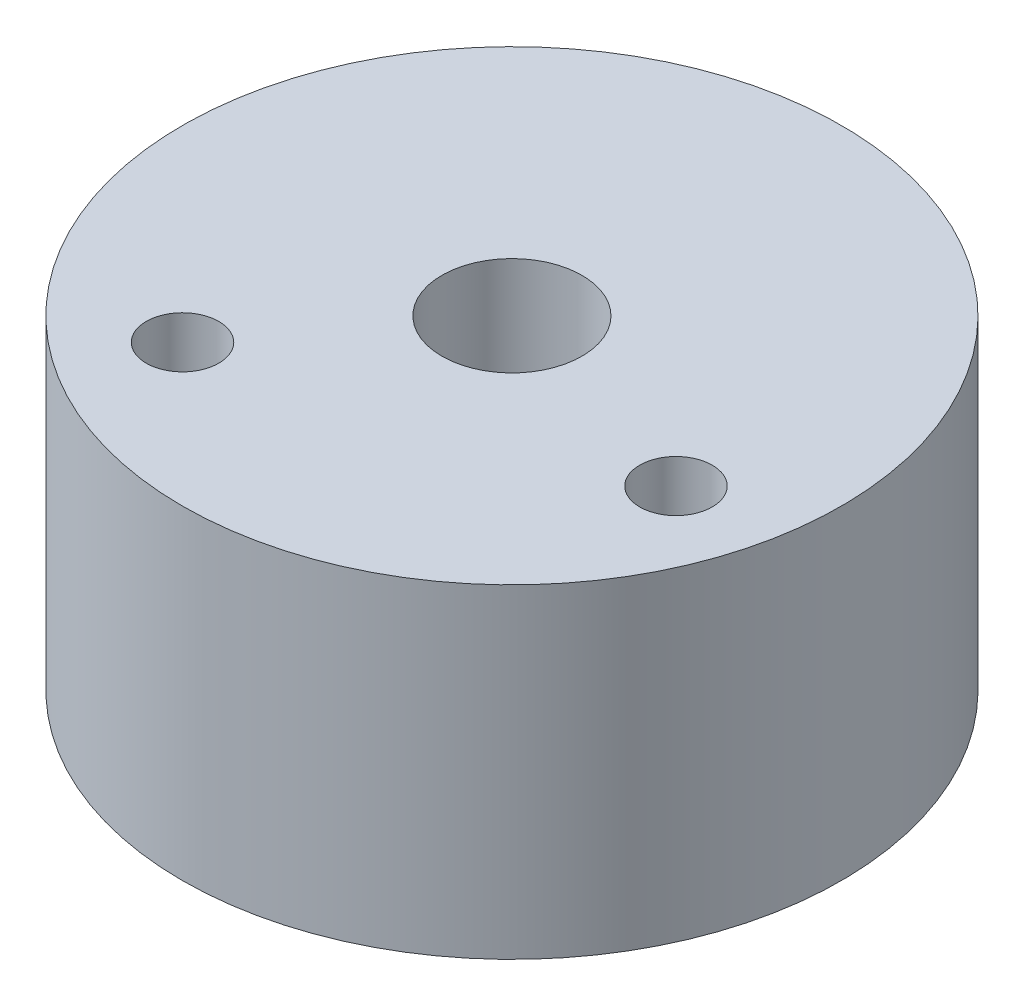
ISO-10303-21;
HEADER;
FILE_DESCRIPTION(('STEP AP214'),'2;1');
FILE_NAME('part.step','',(''),(''),'','','');
FILE_SCHEMA(('AUTOMOTIVE_DESIGN { 1 0 10303 214 1 1 1 1 }'));
ENDSEC;
DATA;
#1=APPLICATION_CONTEXT('core data for automotive mechanical design processes');
#2=APPLICATION_PROTOCOL_DEFINITION('international standard','automotive_design',2000,#1);
#3=PRODUCT_CONTEXT('',#1,'mechanical');
#4=PRODUCT('Part','Part','',(#3));
#5=PRODUCT_RELATED_PRODUCT_CATEGORY('part','',(#4));
#6=PRODUCT_DEFINITION_FORMATION('','',#4);
#7=PRODUCT_DEFINITION_CONTEXT('part definition',#1,'design');
#8=PRODUCT_DEFINITION('design','',#6,#7);
#9=PRODUCT_DEFINITION_SHAPE('','',#8);
#10=(LENGTH_UNIT() NAMED_UNIT(*) SI_UNIT(.MILLI.,.METRE.));
#11=(NAMED_UNIT(*) PLANE_ANGLE_UNIT() SI_UNIT($,.RADIAN.));
#12=(NAMED_UNIT(*) SI_UNIT($,.STERADIAN.) SOLID_ANGLE_UNIT());
#13=UNCERTAINTY_MEASURE_WITH_UNIT(LENGTH_MEASURE(1.E-05),#10,'distance_accuracy_value','');
#14=(GEOMETRIC_REPRESENTATION_CONTEXT(3) GLOBAL_UNCERTAINTY_ASSIGNED_CONTEXT((#13)) GLOBAL_UNIT_ASSIGNED_CONTEXT((#10,
#11,#12)) REPRESENTATION_CONTEXT('',''));
#15=CARTESIAN_POINT('',(0.,0.,0.));
#16=DIRECTION('',(0.,0.,1.));
#17=DIRECTION('',(1.,0.,0.));
#18=AXIS2_PLACEMENT_3D('',#15,#16,#17);
#19=CARTESIAN_POINT('',(0.,15.5973451327434,0.));
#20=DIRECTION('',(0.,1.,0.));
#21=DIRECTION('',(0.,0.,1.));
#22=AXIS2_PLACEMENT_3D('',#19,#20,#21);
#23=CYLINDRICAL_SURFACE('',#22,2.7);
#24=CARTESIAN_POINT('',(0.,6.24999999999999,0.));
#25=DIRECTION('',(0.,1.,0.));
#26=DIRECTION('',(0.,0.,1.));
#27=AXIS2_PLACEMENT_3D('',#24,#25,#26);
#28=CIRCLE('',#27,2.7);
#29=CARTESIAN_POINT('',(0.,6.24999999999999,2.7));
#30=VERTEX_POINT('',#29);
#31=EDGE_CURVE('E11',#30,#30,#28,.T.);
#32=ORIENTED_EDGE('',*,*,#31,.T.);
#33=EDGE_LOOP('',(#32));
#34=FACE_BOUND('',#33,.T.);
#35=CARTESIAN_POINT('',(0.,-6.25000000000001,0.));
#36=DIRECTION('',(0.,1.,0.));
#37=DIRECTION('',(0.,0.,1.));
#38=AXIS2_PLACEMENT_3D('',#35,#36,#37);
#39=CIRCLE('',#38,2.7);
#40=CARTESIAN_POINT('',(0.,-6.25000000000001,2.7));
#41=VERTEX_POINT('',#40);
#42=EDGE_CURVE('E70',#41,#41,#39,.T.);
#43=ORIENTED_EDGE('',*,*,#42,.F.);
#44=EDGE_LOOP('',(#43));
#45=FACE_BOUND('',#44,.T.);
#46=ADVANCED_FACE('F38',(#34,#45),#23,.F.);
#47=CARTESIAN_POINT('',(-12.7,6.25,0.));
#48=DIRECTION('',(0.,1.,0.));
#49=DIRECTION('',(0.,0.,1.));
#50=AXIS2_PLACEMENT_3D('',#47,#48,#49);
#51=PLANE('',#50);
#52=CARTESIAN_POINT('',(-5.46139748778589,6.25,7.23337591562167));
#53=DIRECTION('',(0.,1.,0.));
#54=DIRECTION('',(0.,0.,1.));
#55=AXIS2_PLACEMENT_3D('',#52,#53,#54);
#56=CIRCLE('',#55,1.397);
#57=CARTESIAN_POINT('',(-5.46139748778589,6.25,8.63037591562166));
#58=VERTEX_POINT('',#57);
#59=EDGE_CURVE('E41',#58,#58,#56,.T.);
#60=ORIENTED_EDGE('',*,*,#59,.F.);
#61=EDGE_LOOP('',(#60));
#62=FACE_BOUND('',#61,.T.);
#63=CARTESIAN_POINT('',(8.8438398225786,6.25,2.52283373281074));
#64=DIRECTION('',(0.,1.,0.));
#65=DIRECTION('',(0.,0.,1.));
#66=AXIS2_PLACEMENT_3D('',#63,#64,#65);
#67=CIRCLE('',#66,1.397);
#68=CARTESIAN_POINT('',(8.8438398225786,6.25,3.91983373281074));
#69=VERTEX_POINT('',#68);
#70=EDGE_CURVE('E69',#69,#69,#67,.T.);
#71=ORIENTED_EDGE('',*,*,#70,.F.);
#72=EDGE_LOOP('',(#71));
#73=FACE_BOUND('',#72,.T.);
#74=CARTESIAN_POINT('',(0.,6.25,0.));
#75=DIRECTION('',(0.,1.,0.));
#76=DIRECTION('',(0.,0.,1.));
#77=AXIS2_PLACEMENT_3D('',#74,#75,#76);
#78=CIRCLE('',#77,12.7);
#79=CARTESIAN_POINT('',(0.,6.25,12.7));
#80=VERTEX_POINT('',#79);
#81=EDGE_CURVE('E46',#80,#80,#78,.T.);
#82=ORIENTED_EDGE('',*,*,#81,.T.);
#83=EDGE_LOOP('',(#82));
#84=FACE_BOUND('',#83,.T.);
#85=ORIENTED_EDGE('',*,*,#31,.F.);
#86=EDGE_LOOP('',(#85));
#87=FACE_BOUND('',#86,.T.);
#88=ADVANCED_FACE('F82',(#62,#73,#84,#87),#51,.T.);
#89=CARTESIAN_POINT('',(0.,15.5973451327434,0.));
#90=DIRECTION('',(0.,1.,0.));
#91=DIRECTION('',(0.,0.,1.));
#92=AXIS2_PLACEMENT_3D('',#89,#90,#91);
#93=CYLINDRICAL_SURFACE('',#92,12.7);
#94=CARTESIAN_POINT('',(0.,-6.25,0.));
#95=DIRECTION('',(0.,1.,0.));
#96=DIRECTION('',(0.,0.,1.));
#97=AXIS2_PLACEMENT_3D('',#94,#95,#96);
#98=CIRCLE('',#97,12.7);
#99=CARTESIAN_POINT('',(0.,-6.25,12.7));
#100=VERTEX_POINT('',#99);
#101=EDGE_CURVE('E73',#100,#100,#98,.T.);
#102=ORIENTED_EDGE('',*,*,#101,.T.);
#103=EDGE_LOOP('',(#102));
#104=FACE_BOUND('',#103,.T.);
#105=ORIENTED_EDGE('',*,*,#81,.F.);
#106=EDGE_LOOP('',(#105));
#107=FACE_BOUND('',#106,.T.);
#108=ADVANCED_FACE('F85',(#104,#107),#93,.T.);
#109=CARTESIAN_POINT('',(-12.7,-6.25,0.));
#110=DIRECTION('',(0.,-1.,0.));
#111=DIRECTION('',(0.,0.,-1.));
#112=AXIS2_PLACEMENT_3D('',#109,#110,#111);
#113=PLANE('',#112);
#114=ORIENTED_EDGE('',*,*,#42,.T.);
#115=EDGE_LOOP('',(#114));
#116=FACE_BOUND('',#115,.T.);
#117=ORIENTED_EDGE('',*,*,#101,.F.);
#118=EDGE_LOOP('',(#117));
#119=FACE_BOUND('',#118,.T.);
#120=ADVANCED_FACE('F95',(#116,#119),#113,.T.);
#121=CARTESIAN_POINT('',(8.8438398225786,3.24999999999999,2.52283373281074));
#122=DIRECTION('',(0.,1.,0.));
#123=DIRECTION('',(0.,0.,1.));
#124=AXIS2_PLACEMENT_3D('',#121,#122,#123);
#125=CONICAL_SURFACE('',#124,1.397,1.02974425867665);
#126=CARTESIAN_POINT('',(8.8438398225786,2.41059771521849,2.52283373281074));
#127=VERTEX_POINT('',#126);
#128=VERTEX_LOOP('',#127);
#129=FACE_BOUND('',#128,.T.);
#130=CARTESIAN_POINT('',(8.8438398225786,3.24999999999999,2.52283373281074));
#131=DIRECTION('',(0.,1.,0.));
#132=DIRECTION('',(0.,0.,1.));
#133=AXIS2_PLACEMENT_3D('',#130,#131,#132);
#134=CIRCLE('',#133,1.397);
#135=CARTESIAN_POINT('',(8.8438398225786,3.24999999999999,3.91983373281074));
#136=VERTEX_POINT('',#135);
#137=EDGE_CURVE('E65',#136,#136,#134,.T.);
#138=ORIENTED_EDGE('',*,*,#137,.T.);
#139=EDGE_LOOP('',(#138));
#140=FACE_BOUND('',#139,.T.);
#141=ADVANCED_FACE('F98',(#129,#140),#125,.F.);
#142=CARTESIAN_POINT('',(8.8438398225786,13.25,2.52283373281074));
#143=DIRECTION('',(0.,1.,0.));
#144=DIRECTION('',(0.,0.,1.));
#145=AXIS2_PLACEMENT_3D('',#142,#143,#144);
#146=CYLINDRICAL_SURFACE('',#145,1.397);
#147=ORIENTED_EDGE('',*,*,#70,.T.);
#148=EDGE_LOOP('',(#147));
#149=FACE_BOUND('',#148,.T.);
#150=ORIENTED_EDGE('',*,*,#137,.F.);
#151=EDGE_LOOP('',(#150));
#152=FACE_BOUND('',#151,.T.);
#153=ADVANCED_FACE('F57',(#149,#152),#146,.F.);
#154=CARTESIAN_POINT('',(-5.46139748778589,3.25,7.23337591562167));
#155=DIRECTION('',(0.,1.,0.));
#156=DIRECTION('',(0.,0.,1.));
#157=AXIS2_PLACEMENT_3D('',#154,#155,#156);
#158=CONICAL_SURFACE('',#157,1.397,1.02974425867665);
#159=CARTESIAN_POINT('',(-5.4613974877859,2.4105977152185,7.23337591562167));
#160=VERTEX_POINT('',#159);
#161=VERTEX_LOOP('',#160);
#162=FACE_BOUND('',#161,.T.);
#163=CARTESIAN_POINT('',(-5.46139748778589,3.25,7.23337591562167));
#164=DIRECTION('',(0.,1.,0.));
#165=DIRECTION('',(0.,0.,1.));
#166=AXIS2_PLACEMENT_3D('',#163,#164,#165);
#167=CIRCLE('',#166,1.397);
#168=CARTESIAN_POINT('',(-5.46139748778589,3.25,8.63037591562166));
#169=VERTEX_POINT('',#168);
#170=EDGE_CURVE('E61',#169,#169,#167,.T.);
#171=ORIENTED_EDGE('',*,*,#170,.T.);
#172=EDGE_LOOP('',(#171));
#173=FACE_BOUND('',#172,.T.);
#174=ADVANCED_FACE('F53',(#162,#173),#158,.F.);
#175=CARTESIAN_POINT('',(-5.46139748778589,13.25,7.23337591562166));
#176=DIRECTION('',(0.,1.,0.));
#177=DIRECTION('',(0.,0.,1.));
#178=AXIS2_PLACEMENT_3D('',#175,#176,#177);
#179=CYLINDRICAL_SURFACE('',#178,1.397);
#180=ORIENTED_EDGE('',*,*,#59,.T.);
#181=EDGE_LOOP('',(#180));
#182=FACE_BOUND('',#181,.T.);
#183=ORIENTED_EDGE('',*,*,#170,.F.);
#184=EDGE_LOOP('',(#183));
#185=FACE_BOUND('',#184,.T.);
#186=ADVANCED_FACE('F56',(#182,#185),#179,.F.);
#187=CLOSED_SHELL('',(#46,#88,#108,#120,#141,#153,#174,#186));
#188=MANIFOLD_SOLID_BREP('B2',#187);
#189=ADVANCED_BREP_SHAPE_REPRESENTATION('',(#18,#188),#14);
#190=SHAPE_DEFINITION_REPRESENTATION(#9,#189);
ENDSEC;
END-ISO-10303-21;
